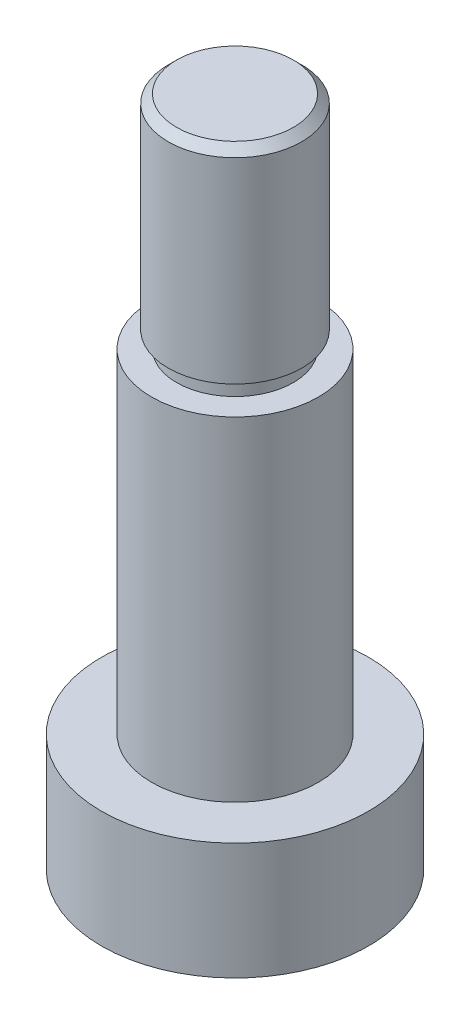
ISO-10303-21;
HEADER;
FILE_DESCRIPTION(('STEP AP214'),'2;1');
FILE_NAME('part.step','',(''),(''),'','','');
FILE_SCHEMA(('AUTOMOTIVE_DESIGN { 1 0 10303 214 1 1 1 1 }'));
ENDSEC;
DATA;
#1=APPLICATION_CONTEXT('core data for automotive mechanical design processes');
#2=APPLICATION_PROTOCOL_DEFINITION('international standard','automotive_design',2000,#1);
#3=PRODUCT_CONTEXT('',#1,'mechanical');
#4=PRODUCT('Part','Part','',(#3));
#5=PRODUCT_RELATED_PRODUCT_CATEGORY('part','',(#4));
#6=PRODUCT_DEFINITION_FORMATION('','',#4);
#7=PRODUCT_DEFINITION_CONTEXT('part definition',#1,'design');
#8=PRODUCT_DEFINITION('design','',#6,#7);
#9=PRODUCT_DEFINITION_SHAPE('','',#8);
#10=(LENGTH_UNIT() NAMED_UNIT(*) SI_UNIT(.MILLI.,.METRE.));
#11=(NAMED_UNIT(*) PLANE_ANGLE_UNIT() SI_UNIT($,.RADIAN.));
#12=(NAMED_UNIT(*) SI_UNIT($,.STERADIAN.) SOLID_ANGLE_UNIT());
#13=UNCERTAINTY_MEASURE_WITH_UNIT(LENGTH_MEASURE(1.E-05),#10,'distance_accuracy_value','');
#14=(GEOMETRIC_REPRESENTATION_CONTEXT(3) GLOBAL_UNCERTAINTY_ASSIGNED_CONTEXT((#13)) GLOBAL_UNIT_ASSIGNED_CONTEXT((#10,
#11,#12)) REPRESENTATION_CONTEXT('',''));
#15=CARTESIAN_POINT('',(0.,0.,0.));
#16=DIRECTION('',(0.,0.,1.));
#17=DIRECTION('',(1.,0.,0.));
#18=AXIS2_PLACEMENT_3D('',#15,#16,#17);
#19=CARTESIAN_POINT('',(0.,20.,0.));
#20=DIRECTION('',(0.,-1.,0.));
#21=DIRECTION('',(0.,0.,-1.));
#22=AXIS2_PLACEMENT_3D('',#19,#20,#21);
#23=CYLINDRICAL_SURFACE('',#22,5.);
#24=CARTESIAN_POINT('',(0.,20.,0.));
#25=DIRECTION('',(0.,1.,0.));
#26=DIRECTION('',(0.,0.,1.));
#27=AXIS2_PLACEMENT_3D('',#24,#25,#26);
#28=CIRCLE('',#27,5.);
#29=CARTESIAN_POINT('',(0.,20.,5.));
#30=VERTEX_POINT('',#29);
#31=EDGE_CURVE('E155',#30,#30,#28,.T.);
#32=ORIENTED_EDGE('',*,*,#31,.F.);
#33=EDGE_LOOP('',(#32));
#34=FACE_BOUND('',#33,.T.);
#35=CARTESIAN_POINT('',(0.,0.,0.));
#36=DIRECTION('',(0.,1.,0.));
#37=DIRECTION('',(0.,0.,1.));
#38=AXIS2_PLACEMENT_3D('',#35,#36,#37);
#39=CIRCLE('',#38,5.);
#40=CARTESIAN_POINT('',(0.,0.,5.));
#41=VERTEX_POINT('',#40);
#42=EDGE_CURVE('E152',#41,#41,#39,.T.);
#43=ORIENTED_EDGE('',*,*,#42,.T.);
#44=EDGE_LOOP('',(#43));
#45=FACE_BOUND('',#44,.T.);
#46=ADVANCED_FACE('F40',(#34,#45),#23,.T.);
#47=CARTESIAN_POINT('',(0.,20.,0.));
#48=DIRECTION('',(0.,1.,0.));
#49=DIRECTION('',(0.,0.,1.));
#50=AXIS2_PLACEMENT_3D('',#47,#48,#49);
#51=PLANE('',#50);
#52=ORIENTED_EDGE('',*,*,#31,.T.);
#53=EDGE_LOOP('',(#52));
#54=FACE_BOUND('',#53,.T.);
#55=CARTESIAN_POINT('',(0.,20.,0.));
#56=DIRECTION('',(0.,1.,0.));
#57=DIRECTION('',(0.,0.,1.));
#58=AXIS2_PLACEMENT_3D('',#55,#56,#57);
#59=CIRCLE('',#58,3.5);
#60=CARTESIAN_POINT('',(0.,20.,3.5));
#61=VERTEX_POINT('',#60);
#62=EDGE_CURVE('E233',#61,#61,#59,.T.);
#63=ORIENTED_EDGE('',*,*,#62,.F.);
#64=EDGE_LOOP('',(#63));
#65=FACE_BOUND('',#64,.T.);
#66=ADVANCED_FACE('F177',(#54,#65),#51,.T.);
#67=CARTESIAN_POINT('',(0.,-7.,0.));
#68=DIRECTION('',(0.,1.,0.));
#69=DIRECTION('',(0.,0.,1.));
#70=AXIS2_PLACEMENT_3D('',#67,#68,#69);
#71=CYLINDRICAL_SURFACE('',#70,8.);
#72=CARTESIAN_POINT('',(0.,-7.,0.));
#73=DIRECTION('',(0.,-1.,0.));
#74=DIRECTION('',(0.,0.,-1.));
#75=AXIS2_PLACEMENT_3D('',#72,#73,#74);
#76=CIRCLE('',#75,8.);
#77=CARTESIAN_POINT('',(0.,-7.,-8.));
#78=VERTEX_POINT('',#77);
#79=EDGE_CURVE('E149',#78,#78,#76,.T.);
#80=ORIENTED_EDGE('',*,*,#79,.F.);
#81=EDGE_LOOP('',(#80));
#82=FACE_BOUND('',#81,.T.);
#83=CARTESIAN_POINT('',(0.,0.,0.));
#84=DIRECTION('',(0.,-1.,0.));
#85=DIRECTION('',(0.,0.,-1.));
#86=AXIS2_PLACEMENT_3D('',#83,#84,#85);
#87=CIRCLE('',#86,8.);
#88=CARTESIAN_POINT('',(0.,0.,-8.));
#89=VERTEX_POINT('',#88);
#90=EDGE_CURVE('E143',#89,#89,#87,.T.);
#91=ORIENTED_EDGE('',*,*,#90,.T.);
#92=EDGE_LOOP('',(#91));
#93=FACE_BOUND('',#92,.T.);
#94=ADVANCED_FACE('F182',(#82,#93),#71,.T.);
#95=CARTESIAN_POINT('',(0.,-7.,0.));
#96=DIRECTION('',(0.,-1.,0.));
#97=DIRECTION('',(0.,0.,-1.));
#98=AXIS2_PLACEMENT_3D('',#95,#96,#97);
#99=PLANE('',#98);
#100=DIRECTION('',(-0.840338909884217,0.,0.542061358643656));
#101=VECTOR('',#100,1.);
#102=CARTESIAN_POINT('',(5.34370368375694,-7.,2.7434528544573));
#103=LINE('',#102,#101);
#104=CARTESIAN_POINT('',(5.34370368375694,-7.,2.7434528544573));
#105=VERTEX_POINT('',#104);
#106=CARTESIAN_POINT('',(0.295951975833515,-7.,5.99950956765865));
#107=VERTEX_POINT('',#106);
#108=EDGE_CURVE('E55',#105,#107,#103,.T.);
#109=ORIENTED_EDGE('',*,*,#108,.F.);
#110=DIRECTION('',(0.0492694520532046,0.,0.998785523070082));
#111=VECTOR('',#110,1.);
#112=CARTESIAN_POINT('',(5.04775170792343,-7.,-3.25605671320135));
#113=LINE('',#112,#111);
#114=CARTESIAN_POINT('',(5.04775170792343,-7.,-3.25605671320135));
#115=VERTEX_POINT('',#114);
#116=EDGE_CURVE('E139',#115,#105,#113,.T.);
#117=ORIENTED_EDGE('',*,*,#116,.F.);
#118=DIRECTION('',(0.889608361937422,0.,0.456724164426426));
#119=VECTOR('',#118,1.);
#120=CARTESIAN_POINT('',(-0.295951975833511,-7.,-5.99950956765865));
#121=LINE('',#120,#119);
#122=CARTESIAN_POINT('',(-0.295951975833511,-7.,-5.99950956765865));
#123=VERTEX_POINT('',#122);
#124=EDGE_CURVE('E137',#123,#115,#121,.T.);
#125=ORIENTED_EDGE('',*,*,#124,.F.);
#126=DIRECTION('',(0.840338909884217,0.,-0.542061358643655));
#127=VECTOR('',#126,1.);
#128=CARTESIAN_POINT('',(-5.34370368375694,-7.,-2.7434528544573));
#129=LINE('',#128,#127);
#130=CARTESIAN_POINT('',(-5.34370368375694,-7.,-2.7434528544573));
#131=VERTEX_POINT('',#130);
#132=EDGE_CURVE('E103',#131,#123,#129,.T.);
#133=ORIENTED_EDGE('',*,*,#132,.F.);
#134=DIRECTION('',(-0.0492694520532045,0.,-0.998785523070082));
#135=VECTOR('',#134,1.);
#136=CARTESIAN_POINT('',(-5.04775170792343,-7.,3.25605671320135));
#137=LINE('',#136,#135);
#138=CARTESIAN_POINT('',(-5.04775170792343,-7.,3.25605671320135));
#139=VERTEX_POINT('',#138);
#140=EDGE_CURVE('E133',#139,#131,#137,.T.);
#141=ORIENTED_EDGE('',*,*,#140,.F.);
#142=DIRECTION('',(-0.889608361937422,0.,-0.456724164426426));
#143=VECTOR('',#142,1.);
#144=CARTESIAN_POINT('',(0.295951975833515,-7.,5.99950956765865));
#145=LINE('',#144,#143);
#146=EDGE_CURVE('E129',#107,#139,#145,.T.);
#147=ORIENTED_EDGE('',*,*,#146,.F.);
#148=EDGE_LOOP('',(#109,#117,#125,#133,#141,#147));
#149=FACE_BOUND('',#148,.T.);
#150=ORIENTED_EDGE('',*,*,#79,.T.);
#151=EDGE_LOOP('',(#150));
#152=FACE_BOUND('',#151,.T.);
#153=ADVANCED_FACE('F190',(#149,#152),#99,.T.);
#154=CARTESIAN_POINT('',(0.,0.,0.));
#155=DIRECTION('',(0.,-1.,0.));
#156=DIRECTION('',(0.,0.,-1.));
#157=AXIS2_PLACEMENT_3D('',#154,#155,#156);
#158=PLANE('',#157);
#159=ORIENTED_EDGE('',*,*,#42,.F.);
#160=EDGE_LOOP('',(#159));
#161=FACE_BOUND('',#160,.T.);
#162=ORIENTED_EDGE('',*,*,#90,.F.);
#163=EDGE_LOOP('',(#162));
#164=FACE_BOUND('',#163,.T.);
#165=ADVANCED_FACE('F192',(#161,#164),#158,.F.);
#166=CARTESIAN_POINT('',(5.34370368375694,-4.,2.7434528544573));
#167=DIRECTION('',(0.542061358643656,0.,0.840338909884217));
#168=DIRECTION('',(0.840338909884217,0.,-0.542061358643656));
#169=AXIS2_PLACEMENT_3D('',#166,#167,#168);
#170=PLANE('',#169);
#171=ORIENTED_EDGE('',*,*,#108,.T.);
#172=DIRECTION('',(0.,-1.,0.));
#173=VECTOR('',#172,1.);
#174=CARTESIAN_POINT('',(0.295951975833515,-4.,5.99950956765865));
#175=LINE('',#174,#173);
#176=CARTESIAN_POINT('',(0.295951975833515,-4.,5.99950956765865));
#177=VERTEX_POINT('',#176);
#178=EDGE_CURVE('E85',#177,#107,#175,.T.);
#179=ORIENTED_EDGE('',*,*,#178,.F.);
#180=DIRECTION('',(-0.840338909884217,0.,0.542061358643656));
#181=VECTOR('',#180,1.);
#182=CARTESIAN_POINT('',(5.34370368375694,-4.,2.7434528544573));
#183=LINE('',#182,#181);
#184=CARTESIAN_POINT('',(5.34370368375694,-4.,2.7434528544573));
#185=VERTEX_POINT('',#184);
#186=EDGE_CURVE('E141',#185,#177,#183,.T.);
#187=ORIENTED_EDGE('',*,*,#186,.F.);
#188=DIRECTION('',(0.,-1.,0.));
#189=VECTOR('',#188,1.);
#190=CARTESIAN_POINT('',(5.34370368375694,-4.,2.7434528544573));
#191=LINE('',#190,#189);
#192=EDGE_CURVE('E63',#185,#105,#191,.T.);
#193=ORIENTED_EDGE('',*,*,#192,.T.);
#194=EDGE_LOOP('',(#171,#179,#187,#193));
#195=FACE_BOUND('',#194,.T.);
#196=ADVANCED_FACE('F195',(#195),#170,.F.);
#197=CARTESIAN_POINT('',(5.04775170792343,-4.,-3.25605671320135));
#198=DIRECTION('',(0.998785523070082,0.,-0.0492694520532046));
#199=DIRECTION('',(-0.0492694520532046,0.,-0.998785523070082));
#200=AXIS2_PLACEMENT_3D('',#197,#198,#199);
#201=PLANE('',#200);
#202=ORIENTED_EDGE('',*,*,#116,.T.);
#203=ORIENTED_EDGE('',*,*,#192,.F.);
#204=DIRECTION('',(0.0492694520532046,0.,0.998785523070082));
#205=VECTOR('',#204,1.);
#206=CARTESIAN_POINT('',(5.04775170792343,-4.,-3.25605671320135));
#207=LINE('',#206,#205);
#208=CARTESIAN_POINT('',(5.04775170792343,-4.,-3.25605671320135));
#209=VERTEX_POINT('',#208);
#210=EDGE_CURVE('E115',#209,#185,#207,.T.);
#211=ORIENTED_EDGE('',*,*,#210,.F.);
#212=DIRECTION('',(0.,-1.,0.));
#213=VECTOR('',#212,1.);
#214=CARTESIAN_POINT('',(5.04775170792343,-4.,-3.25605671320135));
#215=LINE('',#214,#213);
#216=EDGE_CURVE('E107',#209,#115,#215,.T.);
#217=ORIENTED_EDGE('',*,*,#216,.T.);
#218=EDGE_LOOP('',(#202,#203,#211,#217));
#219=FACE_BOUND('',#218,.T.);
#220=ADVANCED_FACE('F202',(#219),#201,.F.);
#221=CARTESIAN_POINT('',(-0.295951975833511,-4.,-5.99950956765865));
#222=DIRECTION('',(0.456724164426426,0.,-0.889608361937422));
#223=DIRECTION('',(-0.889608361937422,0.,-0.456724164426426));
#224=AXIS2_PLACEMENT_3D('',#221,#222,#223);
#225=PLANE('',#224);
#226=ORIENTED_EDGE('',*,*,#124,.T.);
#227=ORIENTED_EDGE('',*,*,#216,.F.);
#228=DIRECTION('',(0.889608361937422,0.,0.456724164426426));
#229=VECTOR('',#228,1.);
#230=CARTESIAN_POINT('',(-0.295951975833511,-4.,-5.99950956765865));
#231=LINE('',#230,#229);
#232=CARTESIAN_POINT('',(-0.295951975833511,-4.,-5.99950956765865));
#233=VERTEX_POINT('',#232);
#234=EDGE_CURVE('E111',#233,#209,#231,.T.);
#235=ORIENTED_EDGE('',*,*,#234,.F.);
#236=DIRECTION('',(0.,-1.,0.));
#237=VECTOR('',#236,1.);
#238=CARTESIAN_POINT('',(-0.295951975833511,-4.,-5.99950956765865));
#239=LINE('',#238,#237);
#240=EDGE_CURVE('E96',#233,#123,#239,.T.);
#241=ORIENTED_EDGE('',*,*,#240,.T.);
#242=EDGE_LOOP('',(#226,#227,#235,#241));
#243=FACE_BOUND('',#242,.T.);
#244=ADVANCED_FACE('F112',(#243),#225,.F.);
#245=CARTESIAN_POINT('',(-5.34370368375694,-4.,-2.7434528544573));
#246=DIRECTION('',(-0.542061358643655,0.,-0.840338909884217));
#247=DIRECTION('',(-0.840338909884217,0.,0.542061358643655));
#248=AXIS2_PLACEMENT_3D('',#245,#246,#247);
#249=PLANE('',#248);
#250=ORIENTED_EDGE('',*,*,#132,.T.);
#251=ORIENTED_EDGE('',*,*,#240,.F.);
#252=DIRECTION('',(0.840338909884217,0.,-0.542061358643655));
#253=VECTOR('',#252,1.);
#254=CARTESIAN_POINT('',(-5.34370368375694,-4.,-2.7434528544573));
#255=LINE('',#254,#253);
#256=CARTESIAN_POINT('',(-5.34370368375694,-4.,-2.7434528544573));
#257=VERTEX_POINT('',#256);
#258=EDGE_CURVE('E100',#257,#233,#255,.T.);
#259=ORIENTED_EDGE('',*,*,#258,.F.);
#260=DIRECTION('',(0.,-1.,0.));
#261=VECTOR('',#260,1.);
#262=CARTESIAN_POINT('',(-5.34370368375694,-4.,-2.7434528544573));
#263=LINE('',#262,#261);
#264=EDGE_CURVE('E108',#257,#131,#263,.T.);
#265=ORIENTED_EDGE('',*,*,#264,.T.);
#266=EDGE_LOOP('',(#250,#251,#259,#265));
#267=FACE_BOUND('',#266,.T.);
#268=ADVANCED_FACE('F98',(#267),#249,.F.);
#269=CARTESIAN_POINT('',(-5.04775170792343,-4.,3.25605671320135));
#270=DIRECTION('',(-0.998785523070082,0.,0.0492694520532045));
#271=DIRECTION('',(0.0492694520532045,0.,0.998785523070082));
#272=AXIS2_PLACEMENT_3D('',#269,#270,#271);
#273=PLANE('',#272);
#274=ORIENTED_EDGE('',*,*,#140,.T.);
#275=ORIENTED_EDGE('',*,*,#264,.F.);
#276=DIRECTION('',(-0.0492694520532045,0.,-0.998785523070082));
#277=VECTOR('',#276,1.);
#278=CARTESIAN_POINT('',(-5.04775170792343,-4.,3.25605671320135));
#279=LINE('',#278,#277);
#280=CARTESIAN_POINT('',(-5.04775170792343,-4.,3.25605671320135));
#281=VERTEX_POINT('',#280);
#282=EDGE_CURVE('E121',#281,#257,#279,.T.);
#283=ORIENTED_EDGE('',*,*,#282,.F.);
#284=DIRECTION('',(0.,-1.,0.));
#285=VECTOR('',#284,1.);
#286=CARTESIAN_POINT('',(-5.04775170792343,-4.,3.25605671320135));
#287=LINE('',#286,#285);
#288=EDGE_CURVE('E146',#281,#139,#287,.T.);
#289=ORIENTED_EDGE('',*,*,#288,.T.);
#290=EDGE_LOOP('',(#274,#275,#283,#289));
#291=FACE_BOUND('',#290,.T.);
#292=ADVANCED_FACE('F206',(#291),#273,.F.);
#293=CARTESIAN_POINT('',(0.295951975833515,-4.,5.99950956765865));
#294=DIRECTION('',(-0.456724164426426,0.,0.889608361937422));
#295=DIRECTION('',(0.889608361937422,0.,0.456724164426426));
#296=AXIS2_PLACEMENT_3D('',#293,#294,#295);
#297=PLANE('',#296);
#298=ORIENTED_EDGE('',*,*,#146,.T.);
#299=ORIENTED_EDGE('',*,*,#288,.F.);
#300=DIRECTION('',(-0.889608361937422,0.,-0.456724164426426));
#301=VECTOR('',#300,1.);
#302=CARTESIAN_POINT('',(0.295951975833515,-4.,5.99950956765865));
#303=LINE('',#302,#301);
#304=EDGE_CURVE('E123',#177,#281,#303,.T.);
#305=ORIENTED_EDGE('',*,*,#304,.F.);
#306=ORIENTED_EDGE('',*,*,#178,.T.);
#307=EDGE_LOOP('',(#298,#299,#305,#306));
#308=FACE_BOUND('',#307,.T.);
#309=ADVANCED_FACE('F203',(#308),#297,.F.);
#310=CARTESIAN_POINT('',(0.,-4.,0.));
#311=DIRECTION('',(0.,-1.,0.));
#312=DIRECTION('',(0.,0.,-1.));
#313=AXIS2_PLACEMENT_3D('',#310,#311,#312);
#314=PLANE('',#313);
#315=ORIENTED_EDGE('',*,*,#186,.T.);
#316=ORIENTED_EDGE('',*,*,#304,.T.);
#317=ORIENTED_EDGE('',*,*,#282,.T.);
#318=ORIENTED_EDGE('',*,*,#258,.T.);
#319=ORIENTED_EDGE('',*,*,#234,.T.);
#320=ORIENTED_EDGE('',*,*,#210,.T.);
#321=EDGE_LOOP('',(#315,#316,#317,#318,#319,#320));
#322=FACE_BOUND('',#321,.T.);
#323=ADVANCED_FACE('F118',(#322),#314,.T.);
#324=CARTESIAN_POINT('',(0.,21.,0.));
#325=DIRECTION('',(0.,1.,0.));
#326=DIRECTION('',(0.,0.,1.));
#327=AXIS2_PLACEMENT_3D('',#324,#325,#326);
#328=PLANE('',#327);
#329=CARTESIAN_POINT('',(0.,21.,0.));
#330=DIRECTION('',(0.,1.,0.));
#331=DIRECTION('',(0.,0.,1.));
#332=AXIS2_PLACEMENT_3D('',#329,#330,#331);
#333=CIRCLE('',#332,4.);
#334=CARTESIAN_POINT('',(0.,21.,4.));
#335=VERTEX_POINT('',#334);
#336=EDGE_CURVE('E130',#335,#335,#333,.T.);
#337=ORIENTED_EDGE('',*,*,#336,.F.);
#338=EDGE_LOOP('',(#337));
#339=FACE_BOUND('',#338,.T.);
#340=CARTESIAN_POINT('',(0.,21.,0.));
#341=DIRECTION('',(0.,1.,0.));
#342=DIRECTION('',(0.,0.,1.));
#343=AXIS2_PLACEMENT_3D('',#340,#341,#342);
#344=CIRCLE('',#343,3.5);
#345=CARTESIAN_POINT('',(0.,21.,3.5));
#346=VERTEX_POINT('',#345);
#347=EDGE_CURVE('E230',#346,#346,#344,.T.);
#348=ORIENTED_EDGE('',*,*,#347,.T.);
#349=EDGE_LOOP('',(#348));
#350=FACE_BOUND('',#349,.T.);
#351=ADVANCED_FACE('F219',(#339,#350),#328,.F.);
#352=CARTESIAN_POINT('',(0.,21.,0.));
#353=DIRECTION('',(0.,-1.,0.));
#354=DIRECTION('',(0.,0.,-1.));
#355=AXIS2_PLACEMENT_3D('',#352,#353,#354);
#356=CYLINDRICAL_SURFACE('',#355,3.5);
#357=ORIENTED_EDGE('',*,*,#347,.F.);
#358=EDGE_LOOP('',(#357));
#359=FACE_BOUND('',#358,.T.);
#360=ORIENTED_EDGE('',*,*,#62,.T.);
#361=EDGE_LOOP('',(#360));
#362=FACE_BOUND('',#361,.T.);
#363=ADVANCED_FACE('F173',(#359,#362),#356,.T.);
#364=CARTESIAN_POINT('',(0.,33.25,0.));
#365=DIRECTION('',(0.,1.,0.));
#366=DIRECTION('',(0.,0.,1.));
#367=AXIS2_PLACEMENT_3D('',#364,#365,#366);
#368=PLANE('',#367);
#369=CARTESIAN_POINT('',(0.,33.25,0.));
#370=DIRECTION('',(0.,1.,0.));
#371=DIRECTION('',(0.,0.,1.));
#372=AXIS2_PLACEMENT_3D('',#369,#370,#371);
#373=CIRCLE('',#372,3.5);
#374=CARTESIAN_POINT('',(0.,33.25,3.5));
#375=VERTEX_POINT('',#374);
#376=EDGE_CURVE('E48',#375,#375,#373,.T.);
#377=ORIENTED_EDGE('',*,*,#376,.T.);
#378=EDGE_LOOP('',(#377));
#379=FACE_BOUND('',#378,.T.);
#380=ADVANCED_FACE('F162',(#379),#368,.T.);
#381=CARTESIAN_POINT('',(0.,33.25,0.));
#382=DIRECTION('',(0.,-1.,0.));
#383=DIRECTION('',(0.,0.,-1.));
#384=AXIS2_PLACEMENT_3D('',#381,#382,#383);
#385=CONICAL_SURFACE('',#384,3.5,0.785398163397445);
#386=CARTESIAN_POINT('',(0.,32.75,0.));
#387=DIRECTION('',(0.,1.,0.));
#388=DIRECTION('',(0.,0.,1.));
#389=AXIS2_PLACEMENT_3D('',#386,#387,#388);
#390=CIRCLE('',#389,4.);
#391=CARTESIAN_POINT('',(0.,32.75,4.));
#392=VERTEX_POINT('',#391);
#393=EDGE_CURVE('E11',#392,#392,#390,.F.);
#394=ORIENTED_EDGE('',*,*,#393,.F.);
#395=EDGE_LOOP('',(#394));
#396=FACE_BOUND('',#395,.T.);
#397=ORIENTED_EDGE('',*,*,#376,.F.);
#398=EDGE_LOOP('',(#397));
#399=FACE_BOUND('',#398,.T.);
#400=ADVANCED_FACE('F42',(#396,#399),#385,.T.);
#401=CARTESIAN_POINT('',(0.,33.25,0.));
#402=DIRECTION('',(0.,-1.,0.));
#403=DIRECTION('',(0.,0.,-1.));
#404=AXIS2_PLACEMENT_3D('',#401,#402,#403);
#405=CYLINDRICAL_SURFACE('',#404,4.);
#406=ORIENTED_EDGE('',*,*,#336,.T.);
#407=EDGE_LOOP('',(#406));
#408=FACE_BOUND('',#407,.T.);
#409=ORIENTED_EDGE('',*,*,#393,.T.);
#410=EDGE_LOOP('',(#409));
#411=FACE_BOUND('',#410,.T.);
#412=ADVANCED_FACE('F165',(#408,#411),#405,.T.);
#413=CLOSED_SHELL('',(#46,#66,#94,#153,#165,#196,#220,#244,#268,#292,#309,#323,#351,#363,#380,
#400,#412));
#414=MANIFOLD_SOLID_BREP('B2',#413);
#415=ADVANCED_BREP_SHAPE_REPRESENTATION('',(#18,#414),#14);
#416=SHAPE_DEFINITION_REPRESENTATION(#9,#415);
ENDSEC;
END-ISO-10303-21;
